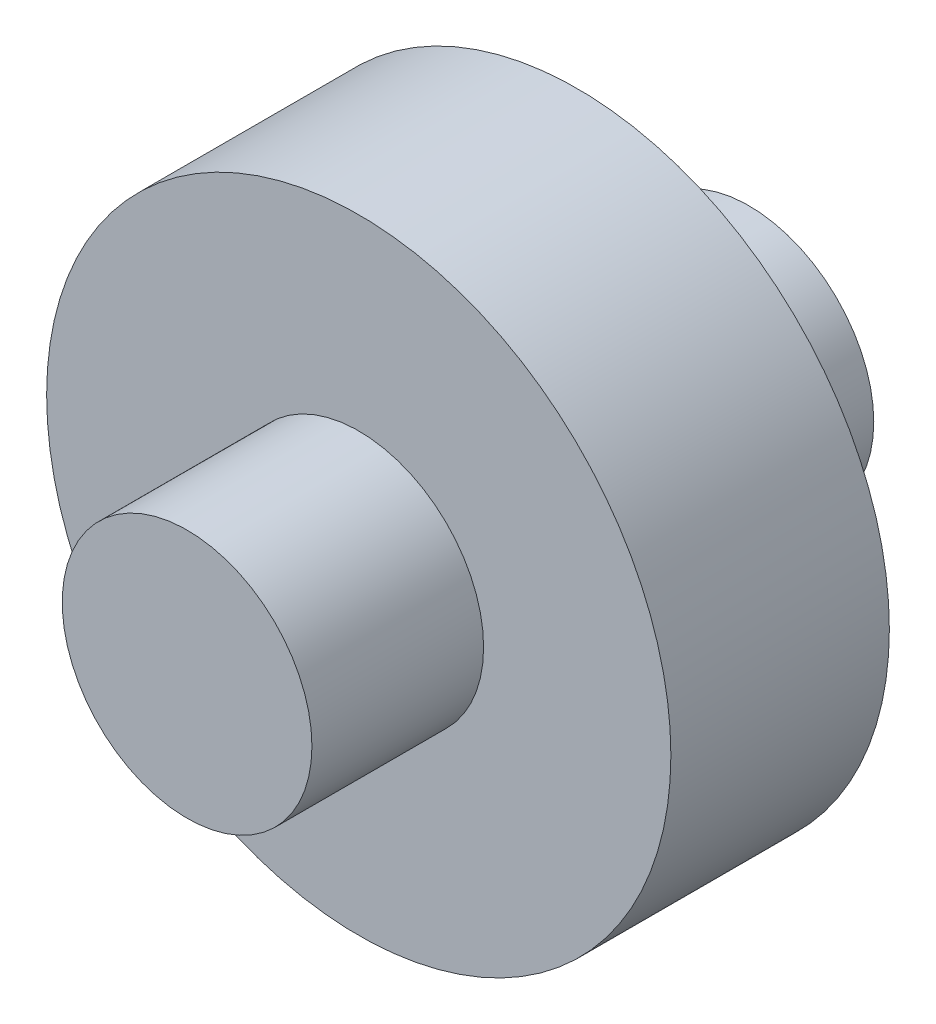
ISO-10303-21;
HEADER;
FILE_DESCRIPTION(('STEP AP214'),'2;1');
FILE_NAME('part.step','',(''),(''),'','','');
FILE_SCHEMA(('AUTOMOTIVE_DESIGN { 1 0 10303 214 1 1 1 1 }'));
ENDSEC;
DATA;
#1=APPLICATION_CONTEXT('core data for automotive mechanical design processes');
#2=APPLICATION_PROTOCOL_DEFINITION('international standard','automotive_design',2000,#1);
#3=PRODUCT_CONTEXT('',#1,'mechanical');
#4=PRODUCT('Part','Part','',(#3));
#5=PRODUCT_RELATED_PRODUCT_CATEGORY('part','',(#4));
#6=PRODUCT_DEFINITION_FORMATION('','',#4);
#7=PRODUCT_DEFINITION_CONTEXT('part definition',#1,'design');
#8=PRODUCT_DEFINITION('design','',#6,#7);
#9=PRODUCT_DEFINITION_SHAPE('','',#8);
#10=(LENGTH_UNIT() NAMED_UNIT(*) SI_UNIT(.MILLI.,.METRE.));
#11=(NAMED_UNIT(*) PLANE_ANGLE_UNIT() SI_UNIT($,.RADIAN.));
#12=(NAMED_UNIT(*) SI_UNIT($,.STERADIAN.) SOLID_ANGLE_UNIT());
#13=UNCERTAINTY_MEASURE_WITH_UNIT(LENGTH_MEASURE(1.E-05),#10,'distance_accuracy_value','');
#14=(GEOMETRIC_REPRESENTATION_CONTEXT(3) GLOBAL_UNCERTAINTY_ASSIGNED_CONTEXT((#13)) GLOBAL_UNIT_ASSIGNED_CONTEXT((#10,
#11,#12)) REPRESENTATION_CONTEXT('',''));
#15=CARTESIAN_POINT('',(0.,0.,0.));
#16=DIRECTION('',(0.,0.,1.));
#17=DIRECTION('',(1.,0.,0.));
#18=AXIS2_PLACEMENT_3D('',#15,#16,#17);
#19=CARTESIAN_POINT('',(0.,0.,9.));
#20=DIRECTION('',(0.,0.,-1.));
#21=DIRECTION('',(-1.,0.,0.));
#22=AXIS2_PLACEMENT_3D('',#19,#20,#21);
#23=CYLINDRICAL_SURFACE('',#22,4.);
#24=CARTESIAN_POINT('',(0.,0.,3.5));
#25=DIRECTION('',(0.,0.,1.));
#26=DIRECTION('',(1.,0.,0.));
#27=AXIS2_PLACEMENT_3D('',#24,#25,#26);
#28=CIRCLE('',#27,4.);
#29=CARTESIAN_POINT('',(4.,0.,3.5));
#30=VERTEX_POINT('',#29);
#31=EDGE_CURVE('E51',#30,#30,#28,.T.);
#32=ORIENTED_EDGE('',*,*,#31,.T.);
#33=EDGE_LOOP('',(#32));
#34=FACE_BOUND('',#33,.T.);
#35=CARTESIAN_POINT('',(0.,0.,9.));
#36=DIRECTION('',(0.,0.,1.));
#37=DIRECTION('',(1.,0.,0.));
#38=AXIS2_PLACEMENT_3D('',#35,#36,#37);
#39=CIRCLE('',#38,4.);
#40=CARTESIAN_POINT('',(4.,0.,9.));
#41=VERTEX_POINT('',#40);
#42=EDGE_CURVE('E37',#41,#41,#39,.T.);
#43=ORIENTED_EDGE('',*,*,#42,.F.);
#44=EDGE_LOOP('',(#43));
#45=FACE_BOUND('',#44,.T.);
#46=ADVANCED_FACE('F31',(#34,#45),#23,.T.);
#47=CARTESIAN_POINT('',(0.,0.,9.));
#48=DIRECTION('',(0.,0.,1.));
#49=DIRECTION('',(1.,0.,0.));
#50=AXIS2_PLACEMENT_3D('',#47,#48,#49);
#51=PLANE('',#50);
#52=ORIENTED_EDGE('',*,*,#42,.T.);
#53=EDGE_LOOP('',(#52));
#54=FACE_BOUND('',#53,.T.);
#55=ADVANCED_FACE('F62',(#54),#51,.T.);
#56=CARTESIAN_POINT('',(0.,0.,3.5));
#57=DIRECTION('',(0.,0.,1.));
#58=DIRECTION('',(1.,0.,0.));
#59=AXIS2_PLACEMENT_3D('',#56,#57,#58);
#60=PLANE('',#59);
#61=CARTESIAN_POINT('',(0.,0.,3.5));
#62=DIRECTION('',(0.,0.,1.));
#63=DIRECTION('',(1.,0.,0.));
#64=AXIS2_PLACEMENT_3D('',#61,#62,#63);
#65=CIRCLE('',#64,10.);
#66=CARTESIAN_POINT('',(10.,0.,3.5));
#67=VERTEX_POINT('',#66);
#68=EDGE_CURVE('E46',#67,#67,#65,.T.);
#69=ORIENTED_EDGE('',*,*,#68,.T.);
#70=EDGE_LOOP('',(#69));
#71=FACE_BOUND('',#70,.T.);
#72=ORIENTED_EDGE('',*,*,#31,.F.);
#73=EDGE_LOOP('',(#72));
#74=FACE_BOUND('',#73,.T.);
#75=ADVANCED_FACE('F59',(#71,#74),#60,.T.);
#76=CARTESIAN_POINT('',(0.,0.,-3.5));
#77=DIRECTION('',(0.,0.,1.));
#78=DIRECTION('',(1.,0.,0.));
#79=AXIS2_PLACEMENT_3D('',#76,#77,#78);
#80=PLANE('',#79);
#81=CARTESIAN_POINT('',(0.,0.,-3.5));
#82=DIRECTION('',(0.,0.,1.));
#83=DIRECTION('',(1.,0.,0.));
#84=AXIS2_PLACEMENT_3D('',#81,#82,#83);
#85=CIRCLE('',#84,10.);
#86=CARTESIAN_POINT('',(10.,0.,-3.5));
#87=VERTEX_POINT('',#86);
#88=EDGE_CURVE('E48',#87,#87,#85,.T.);
#89=ORIENTED_EDGE('',*,*,#88,.F.);
#90=EDGE_LOOP('',(#89));
#91=FACE_BOUND('',#90,.T.);
#92=CARTESIAN_POINT('',(0.,0.,-3.5));
#93=DIRECTION('',(0.,0.,1.));
#94=DIRECTION('',(1.,0.,0.));
#95=AXIS2_PLACEMENT_3D('',#92,#93,#94);
#96=CIRCLE('',#95,4.);
#97=CARTESIAN_POINT('',(4.,0.,-3.5));
#98=VERTEX_POINT('',#97);
#99=EDGE_CURVE('E10',#98,#98,#96,.T.);
#100=ORIENTED_EDGE('',*,*,#99,.T.);
#101=EDGE_LOOP('',(#100));
#102=FACE_BOUND('',#101,.T.);
#103=ADVANCED_FACE('F61',(#91,#102),#80,.F.);
#104=CARTESIAN_POINT('',(0.,0.,3.5));
#105=DIRECTION('',(0.,0.,-1.));
#106=DIRECTION('',(-1.,0.,0.));
#107=AXIS2_PLACEMENT_3D('',#104,#105,#106);
#108=CYLINDRICAL_SURFACE('',#107,10.);
#109=ORIENTED_EDGE('',*,*,#68,.F.);
#110=EDGE_LOOP('',(#109));
#111=FACE_BOUND('',#110,.T.);
#112=ORIENTED_EDGE('',*,*,#88,.T.);
#113=EDGE_LOOP('',(#112));
#114=FACE_BOUND('',#113,.T.);
#115=ADVANCED_FACE('F69',(#111,#114),#108,.T.);
#116=CARTESIAN_POINT('',(0.,0.,-9.));
#117=DIRECTION('',(0.,0.,1.));
#118=DIRECTION('',(1.,0.,0.));
#119=AXIS2_PLACEMENT_3D('',#116,#117,#118);
#120=PLANE('',#119);
#121=CARTESIAN_POINT('',(0.,0.,-9.));
#122=DIRECTION('',(0.,0.,1.));
#123=DIRECTION('',(1.,0.,0.));
#124=AXIS2_PLACEMENT_3D('',#121,#122,#123);
#125=CIRCLE('',#124,4.);
#126=CARTESIAN_POINT('',(4.,0.,-9.));
#127=VERTEX_POINT('',#126);
#128=EDGE_CURVE('E41',#127,#127,#125,.T.);
#129=ORIENTED_EDGE('',*,*,#128,.F.);
#130=EDGE_LOOP('',(#129));
#131=FACE_BOUND('',#130,.T.);
#132=ADVANCED_FACE('F78',(#131),#120,.F.);
#133=ORIENTED_EDGE('',*,*,#128,.T.);
#134=EDGE_LOOP('',(#133));
#135=FACE_BOUND('',#134,.T.);
#136=ORIENTED_EDGE('',*,*,#99,.F.);
#137=EDGE_LOOP('',(#136));
#138=FACE_BOUND('',#137,.T.);
#139=ADVANCED_FACE('F74',(#135,#138),#23,.T.);
#140=CLOSED_SHELL('',(#46,#55,#75,#103,#115,#132,#139));
#141=MANIFOLD_SOLID_BREP('B2',#140);
#142=ADVANCED_BREP_SHAPE_REPRESENTATION('',(#18,#141),#14);
#143=SHAPE_DEFINITION_REPRESENTATION(#9,#142);
ENDSEC;
END-ISO-10303-21;
